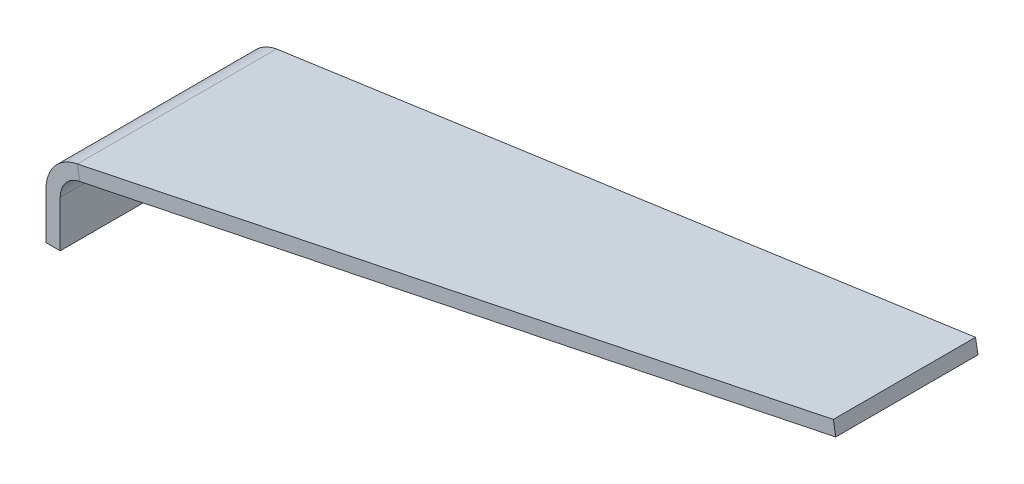
ISO-10303-21;
HEADER;
FILE_DESCRIPTION(('STEP AP214'),'2;1');
FILE_NAME('part.step','',(''),(''),'','','');
FILE_SCHEMA(('AUTOMOTIVE_DESIGN { 1 0 10303 214 1 1 1 1 }'));
ENDSEC;
DATA;
#1=APPLICATION_CONTEXT('core data for automotive mechanical design processes');
#2=APPLICATION_PROTOCOL_DEFINITION('international standard','automotive_design',2000,#1);
#3=PRODUCT_CONTEXT('',#1,'mechanical');
#4=PRODUCT('Part','Part','',(#3));
#5=PRODUCT_RELATED_PRODUCT_CATEGORY('part','',(#4));
#6=PRODUCT_DEFINITION_FORMATION('','',#4);
#7=PRODUCT_DEFINITION_CONTEXT('part definition',#1,'design');
#8=PRODUCT_DEFINITION('design','',#6,#7);
#9=PRODUCT_DEFINITION_SHAPE('','',#8);
#10=(LENGTH_UNIT() NAMED_UNIT(*) SI_UNIT(.MILLI.,.METRE.));
#11=(NAMED_UNIT(*) PLANE_ANGLE_UNIT() SI_UNIT($,.RADIAN.));
#12=(NAMED_UNIT(*) SI_UNIT($,.STERADIAN.) SOLID_ANGLE_UNIT());
#13=UNCERTAINTY_MEASURE_WITH_UNIT(LENGTH_MEASURE(1.E-05),#10,'distance_accuracy_value','');
#14=(GEOMETRIC_REPRESENTATION_CONTEXT(3) GLOBAL_UNCERTAINTY_ASSIGNED_CONTEXT((#13)) GLOBAL_UNIT_ASSIGNED_CONTEXT((#10,
#11,#12)) REPRESENTATION_CONTEXT('',''));
#15=CARTESIAN_POINT('',(0.,0.,0.));
#16=DIRECTION('',(0.,0.,1.));
#17=DIRECTION('',(1.,0.,0.));
#18=AXIS2_PLACEMENT_3D('',#15,#16,#17);
#19=CARTESIAN_POINT('',(3.,10.7,1.15));
#20=DIRECTION('',(0.,-1.,0.));
#21=DIRECTION('',(0.,0.,-1.));
#22=AXIS2_PLACEMENT_3D('',#19,#20,#21);
#23=PLANE('',#22);
#24=DIRECTION('',(1.,0.,0.));
#25=VECTOR('',#24,1.);
#26=CARTESIAN_POINT('',(3.,10.7,5.35));
#27=LINE('',#26,#25);
#28=CARTESIAN_POINT('',(2.7,10.7,5.35));
#29=VERTEX_POINT('',#28);
#30=CARTESIAN_POINT('',(3.,10.7,5.35));
#31=VERTEX_POINT('',#30);
#32=EDGE_CURVE('E35',#29,#31,#27,.T.);
#33=ORIENTED_EDGE('',*,*,#32,.F.);
#34=DIRECTION('',(0.,0.,1.));
#35=VECTOR('',#34,1.);
#36=CARTESIAN_POINT('',(2.7,10.7,1.15));
#37=LINE('',#36,#35);
#38=CARTESIAN_POINT('',(2.7,10.7,1.15));
#39=VERTEX_POINT('',#38);
#40=EDGE_CURVE('E157',#39,#29,#37,.T.);
#41=ORIENTED_EDGE('',*,*,#40,.F.);
#42=DIRECTION('',(1.,0.,0.));
#43=VECTOR('',#42,1.);
#44=CARTESIAN_POINT('',(3.,10.7,1.15));
#45=LINE('',#44,#43);
#46=CARTESIAN_POINT('',(3.,10.7,1.15));
#47=VERTEX_POINT('',#46);
#48=EDGE_CURVE('E11',#39,#47,#45,.T.);
#49=ORIENTED_EDGE('',*,*,#48,.T.);
#50=DIRECTION('',(0.,0.,1.));
#51=VECTOR('',#50,1.);
#52=CARTESIAN_POINT('',(3.,10.7,1.15));
#53=LINE('',#52,#51);
#54=EDGE_CURVE('E26',#47,#31,#53,.T.);
#55=ORIENTED_EDGE('',*,*,#54,.T.);
#56=EDGE_LOOP('',(#33,#41,#49,#55));
#57=FACE_BOUND('',#56,.T.);
#58=ADVANCED_FACE('F16',(#57),#23,.T.);
#59=CARTESIAN_POINT('',(2.7,10.7,1.15));
#60=DIRECTION('',(-1.,0.,0.));
#61=DIRECTION('',(0.,0.,1.));
#62=AXIS2_PLACEMENT_3D('',#59,#60,#61);
#63=PLANE('',#62);
#64=DIRECTION('',(0.,-1.,0.));
#65=VECTOR('',#64,1.);
#66=CARTESIAN_POINT('',(2.7,10.7,5.35));
#67=LINE('',#66,#65);
#68=CARTESIAN_POINT('',(2.7,11.6804501844114,5.35));
#69=VERTEX_POINT('',#68);
#70=EDGE_CURVE('E142',#69,#29,#67,.T.);
#71=ORIENTED_EDGE('',*,*,#70,.F.);
#72=DIRECTION('',(0.,0.,1.));
#73=VECTOR('',#72,1.);
#74=CARTESIAN_POINT('',(2.7,11.6804501844114,1.15));
#75=LINE('',#74,#73);
#76=CARTESIAN_POINT('',(2.7,11.6804501844114,1.15));
#77=VERTEX_POINT('',#76);
#78=EDGE_CURVE('E151',#77,#69,#75,.T.);
#79=ORIENTED_EDGE('',*,*,#78,.F.);
#80=DIRECTION('',(0.,-1.,0.));
#81=VECTOR('',#80,1.);
#82=CARTESIAN_POINT('',(2.7,10.7,1.15));
#83=LINE('',#82,#81);
#84=EDGE_CURVE('E148',#77,#39,#83,.T.);
#85=ORIENTED_EDGE('',*,*,#84,.T.);
#86=ORIENTED_EDGE('',*,*,#40,.T.);
#87=EDGE_LOOP('',(#71,#79,#85,#86));
#88=FACE_BOUND('',#87,.T.);
#89=ADVANCED_FACE('F173',(#88),#63,.T.);
#90=CARTESIAN_POINT('',(3.5,11.6804501844114,1.15));
#91=DIRECTION('',(0.,0.,1.));
#92=DIRECTION('',(1.,0.,0.));
#93=AXIS2_PLACEMENT_3D('',#90,#91,#92);
#94=CYLINDRICAL_SURFACE('',#93,0.8);
#95=CARTESIAN_POINT('',(3.5,11.6804501844114,5.35));
#96=DIRECTION('',(0.,0.,1.));
#97=DIRECTION('',(-1.,0.,0.));
#98=AXIS2_PLACEMENT_3D('',#95,#96,#97);
#99=CIRCLE('',#98,0.799999999999999);
#100=CARTESIAN_POINT('',(3.36108145786646,12.4682963868211,5.35));
#101=VERTEX_POINT('',#100);
#102=EDGE_CURVE('E139',#101,#69,#99,.T.);
#103=ORIENTED_EDGE('',*,*,#102,.F.);
#104=DIRECTION('',(0.,0.,1.));
#105=VECTOR('',#104,1.);
#106=CARTESIAN_POINT('',(3.36108145786646,12.4682963868211,1.15));
#107=LINE('',#106,#105);
#108=CARTESIAN_POINT('',(3.36108145786646,12.4682963868211,1.15));
#109=VERTEX_POINT('',#108);
#110=EDGE_CURVE('E127',#109,#101,#107,.T.);
#111=ORIENTED_EDGE('',*,*,#110,.F.);
#112=CARTESIAN_POINT('',(3.5,11.6804501844114,1.15));
#113=DIRECTION('',(0.,0.,1.));
#114=DIRECTION('',(-1.,0.,0.));
#115=AXIS2_PLACEMENT_3D('',#112,#113,#114);
#116=CIRCLE('',#115,0.799999999999999);
#117=EDGE_CURVE('E117',#109,#77,#116,.T.);
#118=ORIENTED_EDGE('',*,*,#117,.T.);
#119=ORIENTED_EDGE('',*,*,#78,.T.);
#120=EDGE_LOOP('',(#103,#111,#118,#119));
#121=FACE_BOUND('',#120,.T.);
#122=ADVANCED_FACE('F178',(#121),#94,.T.);
#123=CARTESIAN_POINT('',(3.36108145786646,12.4682963868211,1.15));
#124=DIRECTION('',(-0.173648177666927,0.984807753012209,0.));
#125=DIRECTION('',(-0.984807753012209,-0.173648177666927,0.));
#126=AXIS2_PLACEMENT_3D('',#123,#124,#125);
#127=PLANE('',#126);
#128=DIRECTION('',(0.984078327007327,0.173519560181836,0.038481275300621));
#129=VECTOR('',#128,1.);
#130=CARTESIAN_POINT('',(18.7048295948953,15.1738131685745,1.75));
#131=LINE('',#130,#129);
#132=CARTESIAN_POINT('',(18.7048295948953,15.1738131685745,1.75));
#133=VERTEX_POINT('',#132);
#134=EDGE_CURVE('E109',#109,#133,#131,.T.);
#135=ORIENTED_EDGE('',*,*,#134,.F.);
#136=ORIENTED_EDGE('',*,*,#110,.T.);
#137=DIRECTION('',(-0.984078327007327,-0.173519560181836,0.038481275300621));
#138=VECTOR('',#137,1.);
#139=CARTESIAN_POINT('',(3.36108145786646,12.4682963868211,5.35));
#140=LINE('',#139,#138);
#141=CARTESIAN_POINT('',(18.7048295948953,15.1738131685745,4.75));
#142=VERTEX_POINT('',#141);
#143=EDGE_CURVE('E108',#142,#101,#140,.T.);
#144=ORIENTED_EDGE('',*,*,#143,.F.);
#145=DIRECTION('',(0.,0.,1.));
#146=VECTOR('',#145,1.);
#147=CARTESIAN_POINT('',(18.7048295948953,15.1738131685745,1.15));
#148=LINE('',#147,#146);
#149=EDGE_CURVE('E120',#133,#142,#148,.T.);
#150=ORIENTED_EDGE('',*,*,#149,.F.);
#151=EDGE_LOOP('',(#135,#136,#144,#150));
#152=FACE_BOUND('',#151,.T.);
#153=ADVANCED_FACE('F184',(#152),#127,.T.);
#154=CARTESIAN_POINT('',(18.7569240481953,14.8783708426708,1.15));
#155=DIRECTION('',(0.984807753012211,0.173648177666911,0.));
#156=DIRECTION('',(-0.173648177666911,0.984807753012211,0.));
#157=AXIS2_PLACEMENT_3D('',#154,#155,#156);
#158=PLANE('',#157);
#159=DIRECTION('',(-0.173648177666927,0.984807753012209,0.));
#160=VECTOR('',#159,1.);
#161=CARTESIAN_POINT('',(21.3389598023966,0.234918412265884,1.75));
#162=LINE('',#161,#160);
#163=CARTESIAN_POINT('',(18.7569240481953,14.8783708426708,1.75));
#164=VERTEX_POINT('',#163);
#165=EDGE_CURVE('E123',#164,#133,#162,.T.);
#166=ORIENTED_EDGE('',*,*,#165,.T.);
#167=ORIENTED_EDGE('',*,*,#149,.T.);
#168=DIRECTION('',(-0.173648177666927,0.984807753012209,0.));
#169=VECTOR('',#168,1.);
#170=CARTESIAN_POINT('',(21.3389598023966,0.234918412265884,4.75));
#171=LINE('',#170,#169);
#172=CARTESIAN_POINT('',(18.7569240481953,14.8783708426708,4.75));
#173=VERTEX_POINT('',#172);
#174=EDGE_CURVE('E111',#173,#142,#171,.T.);
#175=ORIENTED_EDGE('',*,*,#174,.F.);
#176=DIRECTION('',(0.,0.,1.));
#177=VECTOR('',#176,1.);
#178=CARTESIAN_POINT('',(18.7569240481953,14.8783708426708,1.15));
#179=LINE('',#178,#177);
#180=EDGE_CURVE('E130',#164,#173,#179,.T.);
#181=ORIENTED_EDGE('',*,*,#180,.F.);
#182=EDGE_LOOP('',(#166,#167,#175,#181));
#183=FACE_BOUND('',#182,.T.);
#184=ADVANCED_FACE('F187',(#183),#158,.T.);
#185=CARTESIAN_POINT('',(3.41317591116654,12.1728540609175,1.15));
#186=DIRECTION('',(0.173648177666927,-0.984807753012209,0.));
#187=DIRECTION('',(0.984807753012209,0.173648177666927,0.));
#188=AXIS2_PLACEMENT_3D('',#185,#186,#187);
#189=PLANE('',#188);
#190=DIRECTION('',(0.984078327007327,0.173519560181836,0.038481275300621));
#191=VECTOR('',#190,1.);
#192=CARTESIAN_POINT('',(18.7569240481953,14.8783708426708,1.75));
#193=LINE('',#192,#191);
#194=CARTESIAN_POINT('',(3.41317591116654,12.1728540609175,1.15));
#195=VERTEX_POINT('',#194);
#196=EDGE_CURVE('E124',#195,#164,#193,.T.);
#197=ORIENTED_EDGE('',*,*,#196,.T.);
#198=ORIENTED_EDGE('',*,*,#180,.T.);
#199=DIRECTION('',(-0.984078327007327,-0.173519560181836,0.038481275300621));
#200=VECTOR('',#199,1.);
#201=CARTESIAN_POINT('',(3.41317591116654,12.1728540609175,5.35));
#202=LINE('',#201,#200);
#203=CARTESIAN_POINT('',(3.41317591116654,12.1728540609175,5.35));
#204=VERTEX_POINT('',#203);
#205=EDGE_CURVE('E100',#173,#204,#202,.T.);
#206=ORIENTED_EDGE('',*,*,#205,.T.);
#207=DIRECTION('',(0.,0.,1.));
#208=VECTOR('',#207,1.);
#209=CARTESIAN_POINT('',(3.41317591116654,12.1728540609175,1.15));
#210=LINE('',#209,#208);
#211=EDGE_CURVE('E101',#195,#204,#210,.T.);
#212=ORIENTED_EDGE('',*,*,#211,.F.);
#213=EDGE_LOOP('',(#197,#198,#206,#212));
#214=FACE_BOUND('',#213,.T.);
#215=ADVANCED_FACE('F190',(#214),#189,.T.);
#216=CARTESIAN_POINT('',(3.5,11.6804501844114,1.15));
#217=DIRECTION('',(0.,0.,1.));
#218=DIRECTION('',(1.,0.,0.));
#219=AXIS2_PLACEMENT_3D('',#216,#217,#218);
#220=CYLINDRICAL_SURFACE('',#219,0.5);
#221=CARTESIAN_POINT('',(3.5,11.6804501844114,5.35));
#222=DIRECTION('',(0.,0.,-1.));
#223=DIRECTION('',(-1.,0.,0.));
#224=AXIS2_PLACEMENT_3D('',#221,#222,#223);
#225=CIRCLE('',#224,0.5);
#226=CARTESIAN_POINT('',(3.,11.6804501844114,5.35));
#227=VERTEX_POINT('',#226);
#228=EDGE_CURVE('E78',#227,#204,#225,.T.);
#229=ORIENTED_EDGE('',*,*,#228,.F.);
#230=DIRECTION('',(0.,0.,1.));
#231=VECTOR('',#230,1.);
#232=CARTESIAN_POINT('',(3.,11.6804501844114,1.15));
#233=LINE('',#232,#231);
#234=CARTESIAN_POINT('',(3.,11.6804501844114,1.15));
#235=VERTEX_POINT('',#234);
#236=EDGE_CURVE('E81',#235,#227,#233,.T.);
#237=ORIENTED_EDGE('',*,*,#236,.F.);
#238=CARTESIAN_POINT('',(3.5,11.6804501844114,1.15));
#239=DIRECTION('',(0.,0.,-1.));
#240=DIRECTION('',(-1.,0.,0.));
#241=AXIS2_PLACEMENT_3D('',#238,#239,#240);
#242=CIRCLE('',#241,0.5);
#243=EDGE_CURVE('E84',#235,#195,#242,.T.);
#244=ORIENTED_EDGE('',*,*,#243,.T.);
#245=ORIENTED_EDGE('',*,*,#211,.T.);
#246=EDGE_LOOP('',(#229,#237,#244,#245));
#247=FACE_BOUND('',#246,.T.);
#248=ADVANCED_FACE('F83',(#247),#220,.F.);
#249=CARTESIAN_POINT('',(3.,10.7,1.15));
#250=DIRECTION('',(1.,0.,0.));
#251=DIRECTION('',(0.,0.,-1.));
#252=AXIS2_PLACEMENT_3D('',#249,#250,#251);
#253=PLANE('',#252);
#254=DIRECTION('',(0.,1.,0.));
#255=VECTOR('',#254,1.);
#256=CARTESIAN_POINT('',(3.,10.7,5.35));
#257=LINE('',#256,#255);
#258=EDGE_CURVE('E107',#31,#227,#257,.T.);
#259=ORIENTED_EDGE('',*,*,#258,.F.);
#260=ORIENTED_EDGE('',*,*,#54,.F.);
#261=DIRECTION('',(0.,1.,0.));
#262=VECTOR('',#261,1.);
#263=CARTESIAN_POINT('',(3.,10.7,1.15));
#264=LINE('',#263,#262);
#265=EDGE_CURVE('E90',#47,#235,#264,.T.);
#266=ORIENTED_EDGE('',*,*,#265,.T.);
#267=ORIENTED_EDGE('',*,*,#236,.T.);
#268=EDGE_LOOP('',(#259,#260,#266,#267));
#269=FACE_BOUND('',#268,.T.);
#270=ADVANCED_FACE('F103',(#269),#253,.T.);
#271=CARTESIAN_POINT('',(3.5,11.6804501844114,1.15));
#272=DIRECTION('',(0.,0.,-1.));
#273=DIRECTION('',(-1.,0.,0.));
#274=AXIS2_PLACEMENT_3D('',#271,#272,#273);
#275=PLANE('',#274);
#276=DIRECTION('',(-0.173648177666927,0.984807753012209,0.));
#277=VECTOR('',#276,1.);
#278=CARTESIAN_POINT('',(5.99521166536783,-2.47059836948749,1.15));
#279=LINE('',#278,#277);
#280=EDGE_CURVE('E99',#195,#109,#279,.T.);
#281=ORIENTED_EDGE('',*,*,#280,.F.);
#282=ORIENTED_EDGE('',*,*,#243,.F.);
#283=ORIENTED_EDGE('',*,*,#265,.F.);
#284=ORIENTED_EDGE('',*,*,#48,.F.);
#285=ORIENTED_EDGE('',*,*,#84,.F.);
#286=ORIENTED_EDGE('',*,*,#117,.F.);
#287=EDGE_LOOP('',(#281,#282,#283,#284,#285,#286));
#288=FACE_BOUND('',#287,.T.);
#289=ADVANCED_FACE('F95',(#288),#275,.T.);
#290=CARTESIAN_POINT('',(3.5,11.6804501844114,5.35));
#291=DIRECTION('',(0.,0.,-1.));
#292=DIRECTION('',(-1.,0.,0.));
#293=AXIS2_PLACEMENT_3D('',#290,#291,#292);
#294=PLANE('',#293);
#295=ORIENTED_EDGE('',*,*,#228,.T.);
#296=DIRECTION('',(-0.173648177666927,0.984807753012209,0.));
#297=VECTOR('',#296,1.);
#298=CARTESIAN_POINT('',(5.99521166536783,-2.47059836948749,5.35));
#299=LINE('',#298,#297);
#300=EDGE_CURVE('E20',#204,#101,#299,.T.);
#301=ORIENTED_EDGE('',*,*,#300,.T.);
#302=ORIENTED_EDGE('',*,*,#102,.T.);
#303=ORIENTED_EDGE('',*,*,#70,.T.);
#304=ORIENTED_EDGE('',*,*,#32,.T.);
#305=ORIENTED_EDGE('',*,*,#258,.T.);
#306=EDGE_LOOP('',(#295,#301,#302,#303,#304,#305));
#307=FACE_BOUND('',#306,.T.);
#308=ADVANCED_FACE('F161',(#307),#294,.F.);
#309=CARTESIAN_POINT('',(5.99521166536783,-2.47059836948749,5.35));
#310=DIRECTION('',(-0.0378966582618488,-0.00668220333025218,-0.999259321423242));
#311=DIRECTION('',(-0.999281631554728,0.,0.0378975043679702));
#312=AXIS2_PLACEMENT_3D('',#309,#310,#311);
#313=PLANE('',#312);
#314=ORIENTED_EDGE('',*,*,#174,.T.);
#315=ORIENTED_EDGE('',*,*,#143,.T.);
#316=ORIENTED_EDGE('',*,*,#300,.F.);
#317=ORIENTED_EDGE('',*,*,#205,.F.);
#318=EDGE_LOOP('',(#314,#315,#316,#317));
#319=FACE_BOUND('',#318,.T.);
#320=ADVANCED_FACE('F163',(#319),#313,.F.);
#321=CARTESIAN_POINT('',(21.3389598023966,0.234918412265884,1.75));
#322=DIRECTION('',(-0.0378966582618488,-0.00668220333025218,0.999259321423242));
#323=DIRECTION('',(0.999281631554728,0.,0.0378975043679702));
#324=AXIS2_PLACEMENT_3D('',#321,#322,#323);
#325=PLANE('',#324);
#326=ORIENTED_EDGE('',*,*,#280,.T.);
#327=ORIENTED_EDGE('',*,*,#134,.T.);
#328=ORIENTED_EDGE('',*,*,#165,.F.);
#329=ORIENTED_EDGE('',*,*,#196,.F.);
#330=EDGE_LOOP('',(#326,#327,#328,#329));
#331=FACE_BOUND('',#330,.T.);
#332=ADVANCED_FACE('F18',(#331),#325,.F.);
#333=CLOSED_SHELL('',(#58,#89,#122,#153,#184,#215,#248,#270,#289,#308,#320,#332));
#334=MANIFOLD_SOLID_BREP('B1',#333);
#335=ADVANCED_BREP_SHAPE_REPRESENTATION('',(#18,#334),#14);
#336=SHAPE_DEFINITION_REPRESENTATION(#9,#335);
ENDSEC;
END-ISO-10303-21;
